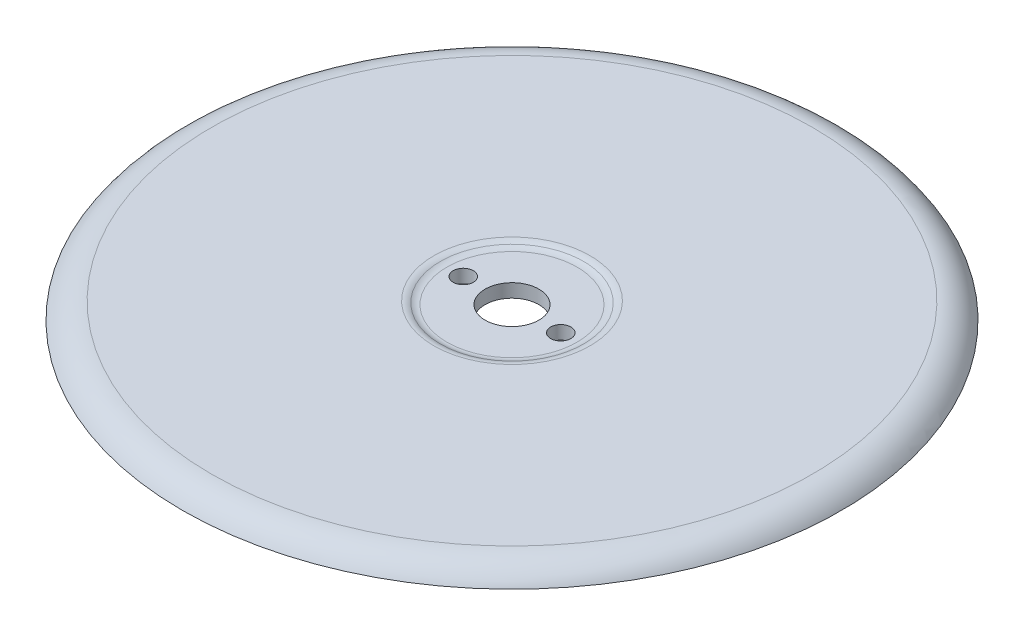
ISO-10303-21;
HEADER;
FILE_DESCRIPTION(('STEP AP214'),'2;1');
FILE_NAME('part.step','',(''),(''),'','','');
FILE_SCHEMA(('AUTOMOTIVE_DESIGN { 1 0 10303 214 1 1 1 1 }'));
ENDSEC;
DATA;
#1=APPLICATION_CONTEXT('core data for automotive mechanical design processes');
#2=APPLICATION_PROTOCOL_DEFINITION('international standard','automotive_design',2000,#1);
#3=PRODUCT_CONTEXT('',#1,'mechanical');
#4=PRODUCT('Part','Part','',(#3));
#5=PRODUCT_RELATED_PRODUCT_CATEGORY('part','',(#4));
#6=PRODUCT_DEFINITION_FORMATION('','',#4);
#7=PRODUCT_DEFINITION_CONTEXT('part definition',#1,'design');
#8=PRODUCT_DEFINITION('design','',#6,#7);
#9=PRODUCT_DEFINITION_SHAPE('','',#8);
#10=(LENGTH_UNIT() NAMED_UNIT(*) SI_UNIT(.MILLI.,.METRE.));
#11=(NAMED_UNIT(*) PLANE_ANGLE_UNIT() SI_UNIT($,.RADIAN.));
#12=(NAMED_UNIT(*) SI_UNIT($,.STERADIAN.) SOLID_ANGLE_UNIT());
#13=UNCERTAINTY_MEASURE_WITH_UNIT(LENGTH_MEASURE(1.E-05),#10,'distance_accuracy_value','');
#14=(GEOMETRIC_REPRESENTATION_CONTEXT(3) GLOBAL_UNCERTAINTY_ASSIGNED_CONTEXT((#13)) GLOBAL_UNIT_ASSIGNED_CONTEXT((#10,
#11,#12)) REPRESENTATION_CONTEXT('',''));
#15=CARTESIAN_POINT('',(0.,0.,0.));
#16=DIRECTION('',(0.,0.,1.));
#17=DIRECTION('',(1.,0.,0.));
#18=AXIS2_PLACEMENT_3D('',#15,#16,#17);
#19=CARTESIAN_POINT('',(0.,2.5,0.));
#20=DIRECTION('',(0.,-1.,0.));
#21=DIRECTION('',(0.,0.,-1.));
#22=AXIS2_PLACEMENT_3D('',#19,#20,#21);
#23=CYLINDRICAL_SURFACE('',#22,4.);
#24=CARTESIAN_POINT('',(0.,0.,0.));
#25=DIRECTION('',(0.,1.,0.));
#26=DIRECTION('',(0.,0.,1.));
#27=AXIS2_PLACEMENT_3D('',#24,#25,#26);
#28=CIRCLE('',#27,4.);
#29=CARTESIAN_POINT('',(0.,0.,4.));
#30=VERTEX_POINT('',#29);
#31=EDGE_CURVE('E62',#30,#30,#28,.T.);
#32=ORIENTED_EDGE('',*,*,#31,.F.);
#33=EDGE_LOOP('',(#32));
#34=FACE_BOUND('',#33,.T.);
#35=CARTESIAN_POINT('',(0.,2.,0.));
#36=DIRECTION('',(0.,1.,0.));
#37=DIRECTION('',(0.,0.,1.));
#38=AXIS2_PLACEMENT_3D('',#35,#36,#37);
#39=CIRCLE('',#38,4.);
#40=CARTESIAN_POINT('',(0.,2.,4.));
#41=VERTEX_POINT('',#40);
#42=EDGE_CURVE('E71',#41,#41,#39,.T.);
#43=ORIENTED_EDGE('',*,*,#42,.T.);
#44=EDGE_LOOP('',(#43));
#45=FACE_BOUND('',#44,.T.);
#46=ADVANCED_FACE('F35',(#34,#45),#23,.F.);
#47=CARTESIAN_POINT('',(7.25,2.5,0.));
#48=DIRECTION('',(0.,-1.,0.));
#49=DIRECTION('',(0.,0.,-1.));
#50=AXIS2_PLACEMENT_3D('',#47,#48,#49);
#51=CYLINDRICAL_SURFACE('',#50,1.5);
#52=CARTESIAN_POINT('',(7.25,0.,0.));
#53=DIRECTION('',(0.,1.,0.));
#54=DIRECTION('',(0.,0.,1.));
#55=AXIS2_PLACEMENT_3D('',#52,#53,#54);
#56=CIRCLE('',#55,1.5);
#57=CARTESIAN_POINT('',(7.25,0.,1.5));
#58=VERTEX_POINT('',#57);
#59=EDGE_CURVE('E65',#58,#58,#56,.T.);
#60=ORIENTED_EDGE('',*,*,#59,.F.);
#61=EDGE_LOOP('',(#60));
#62=FACE_BOUND('',#61,.T.);
#63=CARTESIAN_POINT('',(7.25,2.,0.));
#64=DIRECTION('',(0.,1.,0.));
#65=DIRECTION('',(0.,0.,1.));
#66=AXIS2_PLACEMENT_3D('',#63,#64,#65);
#67=CIRCLE('',#66,1.5);
#68=CARTESIAN_POINT('',(7.25,2.,1.5));
#69=VERTEX_POINT('',#68);
#70=EDGE_CURVE('E59',#69,#69,#67,.T.);
#71=ORIENTED_EDGE('',*,*,#70,.T.);
#72=EDGE_LOOP('',(#71));
#73=FACE_BOUND('',#72,.T.);
#74=ADVANCED_FACE('F77',(#62,#73),#51,.F.);
#75=CARTESIAN_POINT('',(-7.25,2.5,0.));
#76=DIRECTION('',(0.,-1.,0.));
#77=DIRECTION('',(0.,0.,-1.));
#78=AXIS2_PLACEMENT_3D('',#75,#76,#77);
#79=CYLINDRICAL_SURFACE('',#78,1.5);
#80=CARTESIAN_POINT('',(-7.25,0.,0.));
#81=DIRECTION('',(0.,1.,0.));
#82=DIRECTION('',(0.,0.,-1.));
#83=AXIS2_PLACEMENT_3D('',#80,#81,#82);
#84=CIRCLE('',#83,1.5);
#85=CARTESIAN_POINT('',(-7.25,0.,-1.5));
#86=VERTEX_POINT('',#85);
#87=EDGE_CURVE('E68',#86,#86,#84,.T.);
#88=ORIENTED_EDGE('',*,*,#87,.F.);
#89=EDGE_LOOP('',(#88));
#90=FACE_BOUND('',#89,.T.);
#91=CARTESIAN_POINT('',(-7.25,2.,0.));
#92=DIRECTION('',(0.,1.,0.));
#93=DIRECTION('',(0.,0.,1.));
#94=AXIS2_PLACEMENT_3D('',#91,#92,#93);
#95=CIRCLE('',#94,1.5);
#96=CARTESIAN_POINT('',(-7.25,2.,1.5));
#97=VERTEX_POINT('',#96);
#98=EDGE_CURVE('E56',#97,#97,#95,.T.);
#99=ORIENTED_EDGE('',*,*,#98,.T.);
#100=EDGE_LOOP('',(#99));
#101=FACE_BOUND('',#100,.T.);
#102=ADVANCED_FACE('F88',(#90,#101),#79,.F.);
#103=CARTESIAN_POINT('',(0.,2.5,0.));
#104=DIRECTION('',(0.,1.,0.));
#105=DIRECTION('',(0.,0.,1.));
#106=AXIS2_PLACEMENT_3D('',#103,#104,#105);
#107=PLANE('',#106);
#108=CARTESIAN_POINT('',(0.,2.5,0.));
#109=DIRECTION('',(0.,1.,0.));
#110=DIRECTION('',(0.,0.,1.));
#111=AXIS2_PLACEMENT_3D('',#108,#109,#110);
#112=CIRCLE('',#111,44.6698729810778);
#113=CARTESIAN_POINT('',(0.,2.5,44.6698729810778));
#114=VERTEX_POINT('',#113);
#115=EDGE_CURVE('E10',#114,#114,#112,.T.);
#116=ORIENTED_EDGE('',*,*,#115,.T.);
#117=EDGE_LOOP('',(#116));
#118=FACE_BOUND('',#117,.T.);
#119=CARTESIAN_POINT('',(0.,2.5,0.));
#120=DIRECTION('',(0.,1.,0.));
#121=DIRECTION('',(0.,0.,1.));
#122=AXIS2_PLACEMENT_3D('',#119,#120,#121);
#123=CIRCLE('',#122,11.6136160175714);
#124=CARTESIAN_POINT('',(0.,2.5,11.6136160175714));
#125=VERTEX_POINT('',#124);
#126=EDGE_CURVE('E42',#125,#125,#123,.F.);
#127=ORIENTED_EDGE('',*,*,#126,.T.);
#128=EDGE_LOOP('',(#127));
#129=FACE_BOUND('',#128,.T.);
#130=ADVANCED_FACE('F90',(#118,#129),#107,.T.);
#131=CARTESIAN_POINT('',(0.,0.,0.));
#132=DIRECTION('',(0.,1.,0.));
#133=DIRECTION('',(0.,0.,1.));
#134=AXIS2_PLACEMENT_3D('',#131,#132,#133);
#135=PLANE('',#134);
#136=CARTESIAN_POINT('',(0.,0.,0.));
#137=DIRECTION('',(0.,1.,0.));
#138=DIRECTION('',(0.,0.,1.));
#139=AXIS2_PLACEMENT_3D('',#136,#137,#138);
#140=CIRCLE('',#139,49.);
#141=CARTESIAN_POINT('',(0.,0.,49.));
#142=VERTEX_POINT('',#141);
#143=EDGE_CURVE('E55',#142,#142,#140,.T.);
#144=ORIENTED_EDGE('',*,*,#143,.F.);
#145=EDGE_LOOP('',(#144));
#146=FACE_BOUND('',#145,.T.);
#147=ORIENTED_EDGE('',*,*,#31,.T.);
#148=EDGE_LOOP('',(#147));
#149=FACE_BOUND('',#148,.T.);
#150=ORIENTED_EDGE('',*,*,#59,.T.);
#151=EDGE_LOOP('',(#150));
#152=FACE_BOUND('',#151,.T.);
#153=ORIENTED_EDGE('',*,*,#87,.T.);
#154=EDGE_LOOP('',(#153));
#155=FACE_BOUND('',#154,.T.);
#156=ADVANCED_FACE('F83',(#146,#149,#152,#155),#135,.F.);
#157=CARTESIAN_POINT('',(0.,2.,0.));
#158=DIRECTION('',(0.,1.,0.));
#159=DIRECTION('',(0.,0.,1.));
#160=AXIS2_PLACEMENT_3D('',#157,#158,#159);
#161=PLANE('',#160);
#162=CARTESIAN_POINT('',(0.,2.,0.));
#163=DIRECTION('',(0.,1.,0.));
#164=DIRECTION('',(0.,0.,1.));
#165=AXIS2_PLACEMENT_3D('',#162,#163,#164);
#166=CIRCLE('',#165,9.6771243444677);
#167=CARTESIAN_POINT('',(0.,2.,9.6771243444677));
#168=VERTEX_POINT('',#167);
#169=EDGE_CURVE('E50',#168,#168,#166,.T.);
#170=ORIENTED_EDGE('',*,*,#169,.T.);
#171=EDGE_LOOP('',(#170));
#172=FACE_BOUND('',#171,.T.);
#173=ORIENTED_EDGE('',*,*,#42,.F.);
#174=EDGE_LOOP('',(#173));
#175=FACE_BOUND('',#174,.T.);
#176=ORIENTED_EDGE('',*,*,#70,.F.);
#177=EDGE_LOOP('',(#176));
#178=FACE_BOUND('',#177,.T.);
#179=ORIENTED_EDGE('',*,*,#98,.F.);
#180=EDGE_LOOP('',(#179));
#181=FACE_BOUND('',#180,.T.);
#182=ADVANCED_FACE('F79',(#172,#175,#178,#181),#161,.T.);
#183=CARTESIAN_POINT('',(0.,4.,0.));
#184=DIRECTION('',(0.,-1.,0.));
#185=DIRECTION('',(0.,0.,-1.));
#186=AXIS2_PLACEMENT_3D('',#183,#184,#185);
#187=TOROIDAL_SURFACE('',#186,9.6771243444677,2.);
#188=CARTESIAN_POINT('',(0.,2.25000000000002,0.));
#189=DIRECTION('',(0.,1.,0.));
#190=DIRECTION('',(0.,0.,1.));
#191=AXIS2_PLACEMENT_3D('',#188,#189,#190);
#192=CIRCLE('',#191,10.6453701810195);
#193=CARTESIAN_POINT('',(0.,2.25000000000002,10.6453701810195));
#194=VERTEX_POINT('',#193);
#195=EDGE_CURVE('E46',#194,#194,#192,.T.);
#196=ORIENTED_EDGE('',*,*,#195,.T.);
#197=EDGE_LOOP('',(#196));
#198=FACE_BOUND('',#197,.T.);
#199=ORIENTED_EDGE('',*,*,#169,.F.);
#200=EDGE_LOOP('',(#199));
#201=FACE_BOUND('',#200,.T.);
#202=ADVANCED_FACE('F82',(#198,#201),#187,.F.);
#203=CARTESIAN_POINT('',(0.,0.5,0.));
#204=DIRECTION('',(0.,1.,0.));
#205=DIRECTION('',(0.,0.,1.));
#206=AXIS2_PLACEMENT_3D('',#203,#204,#205);
#207=TOROIDAL_SURFACE('',#206,11.6136160175714,2.);
#208=ORIENTED_EDGE('',*,*,#126,.F.);
#209=EDGE_LOOP('',(#208));
#210=FACE_BOUND('',#209,.T.);
#211=ORIENTED_EDGE('',*,*,#195,.F.);
#212=EDGE_LOOP('',(#211));
#213=FACE_BOUND('',#212,.T.);
#214=ADVANCED_FACE('F113',(#210,#213),#207,.T.);
#215=CARTESIAN_POINT('',(0.,-2.5,0.));
#216=DIRECTION('',(0.,-1.,0.));
#217=DIRECTION('',(0.,0.,-1.));
#218=AXIS2_PLACEMENT_3D('',#215,#216,#217);
#219=TOROIDAL_SURFACE('',#218,44.6698729810778,5.);
#220=ORIENTED_EDGE('',*,*,#143,.T.);
#221=EDGE_LOOP('',(#220));
#222=FACE_BOUND('',#221,.T.);
#223=ORIENTED_EDGE('',*,*,#115,.F.);
#224=EDGE_LOOP('',(#223));
#225=FACE_BOUND('',#224,.T.);
#226=ADVANCED_FACE('F37',(#222,#225),#219,.T.);
#227=CLOSED_SHELL('',(#46,#74,#102,#130,#156,#182,#202,#214,#226));
#228=MANIFOLD_SOLID_BREP('B2',#227);
#229=ADVANCED_BREP_SHAPE_REPRESENTATION('',(#18,#228),#14);
#230=SHAPE_DEFINITION_REPRESENTATION(#9,#229);
ENDSEC;
END-ISO-10303-21;
